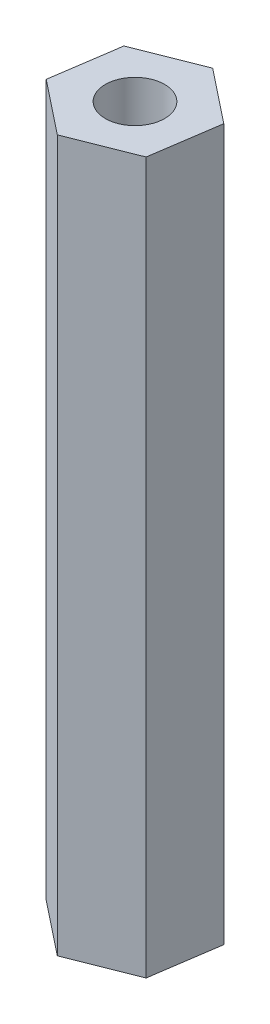
ISO-10303-21;
HEADER;
FILE_DESCRIPTION(('STEP AP214'),'2;1');
FILE_NAME('part.step','',(''),(''),'','','');
FILE_SCHEMA(('AUTOMOTIVE_DESIGN { 1 0 10303 214 1 1 1 1 }'));
ENDSEC;
DATA;
#1=APPLICATION_CONTEXT('core data for automotive mechanical design processes');
#2=APPLICATION_PROTOCOL_DEFINITION('international standard','automotive_design',2000,#1);
#3=PRODUCT_CONTEXT('',#1,'mechanical');
#4=PRODUCT('Part','Part','',(#3));
#5=PRODUCT_RELATED_PRODUCT_CATEGORY('part','',(#4));
#6=PRODUCT_DEFINITION_FORMATION('','',#4);
#7=PRODUCT_DEFINITION_CONTEXT('part definition',#1,'design');
#8=PRODUCT_DEFINITION('design','',#6,#7);
#9=PRODUCT_DEFINITION_SHAPE('','',#8);
#10=(LENGTH_UNIT() NAMED_UNIT(*) SI_UNIT(.MILLI.,.METRE.));
#11=(NAMED_UNIT(*) PLANE_ANGLE_UNIT() SI_UNIT($,.RADIAN.));
#12=(NAMED_UNIT(*) SI_UNIT($,.STERADIAN.) SOLID_ANGLE_UNIT());
#13=UNCERTAINTY_MEASURE_WITH_UNIT(LENGTH_MEASURE(1.E-05),#10,'distance_accuracy_value','');
#14=(GEOMETRIC_REPRESENTATION_CONTEXT(3) GLOBAL_UNCERTAINTY_ASSIGNED_CONTEXT((#13)) GLOBAL_UNIT_ASSIGNED_CONTEXT((#10,
#11,#12)) REPRESENTATION_CONTEXT('',''));
#15=CARTESIAN_POINT('',(0.,0.,0.));
#16=DIRECTION('',(0.,0.,1.));
#17=DIRECTION('',(1.,0.,0.));
#18=AXIS2_PLACEMENT_3D('',#15,#16,#17);
#19=CARTESIAN_POINT('',(0.,36.,0.));
#20=DIRECTION('',(0.,1.,0.));
#21=DIRECTION('',(0.,0.,1.));
#22=AXIS2_PLACEMENT_3D('',#19,#20,#21);
#23=PLANE('',#22);
#24=DIRECTION('',(0.929567430255253,0.,-0.368652129532227));
#25=VECTOR('',#24,1.);
#26=CARTESIAN_POINT('',(-0.504101629666654,36.,3.42722650943404));
#27=LINE('',#26,#25);
#28=CARTESIAN_POINT('',(-0.504101629666654,36.,3.42722650943404));
#29=VERTEX_POINT('',#28);
#30=CARTESIAN_POINT('',(2.71601440686002,36.,2.15017807209748));
#31=VERTEX_POINT('',#30);
#32=EDGE_CURVE('E128',#29,#31,#27,.T.);
#33=ORIENTED_EDGE('',*,*,#32,.T.);
#34=DIRECTION('',(0.145521605793486,0.,-0.989355073897782));
#35=VECTOR('',#34,1.);
#36=CARTESIAN_POINT('',(2.71601440686002,36.,2.15017807209748));
#37=LINE('',#36,#35);
#38=CARTESIAN_POINT('',(3.22011603652667,36.,-1.27704843733656));
#39=VERTEX_POINT('',#38);
#40=EDGE_CURVE('E86',#31,#39,#37,.T.);
#41=ORIENTED_EDGE('',*,*,#40,.T.);
#42=DIRECTION('',(-0.784045824461767,0.,-0.620702944365555));
#43=VECTOR('',#42,1.);
#44=CARTESIAN_POINT('',(3.22011603652667,36.,-1.27704843733656));
#45=LINE('',#44,#43);
#46=CARTESIAN_POINT('',(0.504101629666656,36.,-3.42722650943404));
#47=VERTEX_POINT('',#46);
#48=EDGE_CURVE('E99',#39,#47,#45,.T.);
#49=ORIENTED_EDGE('',*,*,#48,.T.);
#50=DIRECTION('',(-0.929567430255253,0.,0.368652129532227));
#51=VECTOR('',#50,1.);
#52=CARTESIAN_POINT('',(0.504101629666656,36.,-3.42722650943404));
#53=LINE('',#52,#51);
#54=CARTESIAN_POINT('',(-2.71601440686002,36.,-2.15017807209748));
#55=VERTEX_POINT('',#54);
#56=EDGE_CURVE('E93',#47,#55,#53,.T.);
#57=ORIENTED_EDGE('',*,*,#56,.T.);
#58=DIRECTION('',(-0.145521605793486,0.,0.989355073897782));
#59=VECTOR('',#58,1.);
#60=CARTESIAN_POINT('',(-2.71601440686002,36.,-2.15017807209748));
#61=LINE('',#60,#59);
#62=CARTESIAN_POINT('',(-3.22011603652667,36.,1.27704843733656));
#63=VERTEX_POINT('',#62);
#64=EDGE_CURVE('E97',#55,#63,#61,.T.);
#65=ORIENTED_EDGE('',*,*,#64,.T.);
#66=DIRECTION('',(0.784045824461767,0.,0.620702944365555));
#67=VECTOR('',#66,1.);
#68=CARTESIAN_POINT('',(-3.22011603652667,36.,1.27704843733656));
#69=LINE('',#68,#67);
#70=EDGE_CURVE('E49',#63,#29,#69,.T.);
#71=ORIENTED_EDGE('',*,*,#70,.T.);
#72=EDGE_LOOP('',(#33,#41,#49,#57,#65,#71));
#73=FACE_BOUND('',#72,.T.);
#74=CARTESIAN_POINT('',(0.,36.,0.));
#75=DIRECTION('',(0.,1.,0.));
#76=DIRECTION('',(0.,0.,1.));
#77=AXIS2_PLACEMENT_3D('',#74,#75,#76);
#78=CIRCLE('',#77,1.5);
#79=CARTESIAN_POINT('',(0.,36.,1.5));
#80=VERTEX_POINT('',#79);
#81=EDGE_CURVE('E121',#80,#80,#78,.T.);
#82=ORIENTED_EDGE('',*,*,#81,.F.);
#83=EDGE_LOOP('',(#82));
#84=FACE_BOUND('',#83,.T.);
#85=ADVANCED_FACE('F32',(#73,#84),#23,.T.);
#86=CARTESIAN_POINT('',(0.,0.,0.));
#87=DIRECTION('',(0.,1.,0.));
#88=DIRECTION('',(0.,0.,1.));
#89=AXIS2_PLACEMENT_3D('',#86,#87,#88);
#90=PLANE('',#89);
#91=DIRECTION('',(0.929567430255253,0.,-0.368652129532227));
#92=VECTOR('',#91,1.);
#93=CARTESIAN_POINT('',(-0.504101629666654,0.,3.42722650943404));
#94=LINE('',#93,#92);
#95=CARTESIAN_POINT('',(-0.504101629666654,0.,3.42722650943404));
#96=VERTEX_POINT('',#95);
#97=CARTESIAN_POINT('',(2.71601440686002,0.,2.15017807209748));
#98=VERTEX_POINT('',#97);
#99=EDGE_CURVE('E117',#96,#98,#94,.T.);
#100=ORIENTED_EDGE('',*,*,#99,.F.);
#101=DIRECTION('',(0.784045824461767,0.,0.620702944365555));
#102=VECTOR('',#101,1.);
#103=CARTESIAN_POINT('',(-3.22011603652667,0.,1.27704843733656));
#104=LINE('',#103,#102);
#105=CARTESIAN_POINT('',(-3.22011603652667,0.,1.27704843733656));
#106=VERTEX_POINT('',#105);
#107=EDGE_CURVE('E78',#106,#96,#104,.T.);
#108=ORIENTED_EDGE('',*,*,#107,.F.);
#109=DIRECTION('',(-0.145521605793486,0.,0.989355073897782));
#110=VECTOR('',#109,1.);
#111=CARTESIAN_POINT('',(-2.71601440686002,0.,-2.15017807209748));
#112=LINE('',#111,#110);
#113=CARTESIAN_POINT('',(-2.71601440686002,0.,-2.15017807209748));
#114=VERTEX_POINT('',#113);
#115=EDGE_CURVE('E72',#114,#106,#112,.T.);
#116=ORIENTED_EDGE('',*,*,#115,.F.);
#117=DIRECTION('',(-0.929567430255253,0.,0.368652129532227));
#118=VECTOR('',#117,1.);
#119=CARTESIAN_POINT('',(0.504101629666656,0.,-3.42722650943404));
#120=LINE('',#119,#118);
#121=CARTESIAN_POINT('',(0.504101629666656,0.,-3.42722650943404));
#122=VERTEX_POINT('',#121);
#123=EDGE_CURVE('E107',#122,#114,#120,.T.);
#124=ORIENTED_EDGE('',*,*,#123,.F.);
#125=DIRECTION('',(-0.784045824461767,0.,-0.620702944365555));
#126=VECTOR('',#125,1.);
#127=CARTESIAN_POINT('',(3.22011603652667,0.,-1.27704843733656));
#128=LINE('',#127,#126);
#129=CARTESIAN_POINT('',(3.22011603652667,0.,-1.27704843733656));
#130=VERTEX_POINT('',#129);
#131=EDGE_CURVE('E123',#130,#122,#128,.T.);
#132=ORIENTED_EDGE('',*,*,#131,.F.);
#133=DIRECTION('',(0.145521605793486,0.,-0.989355073897782));
#134=VECTOR('',#133,1.);
#135=CARTESIAN_POINT('',(2.71601440686002,0.,2.15017807209748));
#136=LINE('',#135,#134);
#137=EDGE_CURVE('E120',#98,#130,#136,.T.);
#138=ORIENTED_EDGE('',*,*,#137,.F.);
#139=EDGE_LOOP('',(#100,#108,#116,#124,#132,#138));
#140=FACE_BOUND('',#139,.T.);
#141=CARTESIAN_POINT('',(0.,0.,0.));
#142=DIRECTION('',(0.,1.,0.));
#143=DIRECTION('',(0.,0.,1.));
#144=AXIS2_PLACEMENT_3D('',#141,#142,#143);
#145=CIRCLE('',#144,1.5);
#146=CARTESIAN_POINT('',(0.,0.,1.5));
#147=VERTEX_POINT('',#146);
#148=EDGE_CURVE('E221',#147,#147,#145,.T.);
#149=ORIENTED_EDGE('',*,*,#148,.T.);
#150=EDGE_LOOP('',(#149));
#151=FACE_BOUND('',#150,.T.);
#152=ADVANCED_FACE('F137',(#140,#151),#90,.F.);
#153=CARTESIAN_POINT('',(-0.504101629666654,36.,3.42722650943404));
#154=DIRECTION('',(-0.368652129532227,0.,-0.929567430255253));
#155=DIRECTION('',(-0.929567430255253,0.,0.368652129532227));
#156=AXIS2_PLACEMENT_3D('',#153,#154,#155);
#157=PLANE('',#156);
#158=ORIENTED_EDGE('',*,*,#99,.T.);
#159=DIRECTION('',(0.,-1.,0.));
#160=VECTOR('',#159,1.);
#161=CARTESIAN_POINT('',(2.71601440686002,36.,2.15017807209748));
#162=LINE('',#161,#160);
#163=EDGE_CURVE('E11',#31,#98,#162,.T.);
#164=ORIENTED_EDGE('',*,*,#163,.F.);
#165=ORIENTED_EDGE('',*,*,#32,.F.);
#166=DIRECTION('',(0.,-1.,0.));
#167=VECTOR('',#166,1.);
#168=CARTESIAN_POINT('',(-0.504101629666654,36.,3.42722650943404));
#169=LINE('',#168,#167);
#170=EDGE_CURVE('E113',#29,#96,#169,.T.);
#171=ORIENTED_EDGE('',*,*,#170,.T.);
#172=EDGE_LOOP('',(#158,#164,#165,#171));
#173=FACE_BOUND('',#172,.T.);
#174=ADVANCED_FACE('F34',(#173),#157,.F.);
#175=CARTESIAN_POINT('',(2.71601440686002,36.,2.15017807209748));
#176=DIRECTION('',(-0.989355073897782,0.,-0.145521605793486));
#177=DIRECTION('',(-0.145521605793486,0.,0.989355073897782));
#178=AXIS2_PLACEMENT_3D('',#175,#176,#177);
#179=PLANE('',#178);
#180=ORIENTED_EDGE('',*,*,#137,.T.);
#181=DIRECTION('',(0.,-1.,0.));
#182=VECTOR('',#181,1.);
#183=CARTESIAN_POINT('',(3.22011603652667,36.,-1.27704843733656));
#184=LINE('',#183,#182);
#185=EDGE_CURVE('E41',#39,#130,#184,.T.);
#186=ORIENTED_EDGE('',*,*,#185,.F.);
#187=ORIENTED_EDGE('',*,*,#40,.F.);
#188=ORIENTED_EDGE('',*,*,#163,.T.);
#189=EDGE_LOOP('',(#180,#186,#187,#188));
#190=FACE_BOUND('',#189,.T.);
#191=ADVANCED_FACE('F162',(#190),#179,.F.);
#192=CARTESIAN_POINT('',(3.22011603652667,36.,-1.27704843733656));
#193=DIRECTION('',(-0.620702944365555,0.,0.784045824461766));
#194=DIRECTION('',(0.784045824461767,0.,0.620702944365555));
#195=AXIS2_PLACEMENT_3D('',#192,#193,#194);
#196=PLANE('',#195);
#197=ORIENTED_EDGE('',*,*,#131,.T.);
#198=DIRECTION('',(0.,-1.,0.));
#199=VECTOR('',#198,1.);
#200=CARTESIAN_POINT('',(0.504101629666656,36.,-3.42722650943404));
#201=LINE('',#200,#199);
#202=EDGE_CURVE('E108',#47,#122,#201,.T.);
#203=ORIENTED_EDGE('',*,*,#202,.F.);
#204=ORIENTED_EDGE('',*,*,#48,.F.);
#205=ORIENTED_EDGE('',*,*,#185,.T.);
#206=EDGE_LOOP('',(#197,#203,#204,#205));
#207=FACE_BOUND('',#206,.T.);
#208=ADVANCED_FACE('F134',(#207),#196,.F.);
#209=CARTESIAN_POINT('',(0.504101629666656,36.,-3.42722650943404));
#210=DIRECTION('',(0.368652129532227,0.,0.929567430255253));
#211=DIRECTION('',(0.929567430255253,0.,-0.368652129532227));
#212=AXIS2_PLACEMENT_3D('',#209,#210,#211);
#213=PLANE('',#212);
#214=ORIENTED_EDGE('',*,*,#123,.T.);
#215=DIRECTION('',(0.,-1.,0.));
#216=VECTOR('',#215,1.);
#217=CARTESIAN_POINT('',(-2.71601440686002,36.,-2.15017807209748));
#218=LINE('',#217,#216);
#219=EDGE_CURVE('E104',#55,#114,#218,.T.);
#220=ORIENTED_EDGE('',*,*,#219,.F.);
#221=ORIENTED_EDGE('',*,*,#56,.F.);
#222=ORIENTED_EDGE('',*,*,#202,.T.);
#223=EDGE_LOOP('',(#214,#220,#221,#222));
#224=FACE_BOUND('',#223,.T.);
#225=ADVANCED_FACE('F105',(#224),#213,.F.);
#226=CARTESIAN_POINT('',(-2.71601440686002,36.,-2.15017807209748));
#227=DIRECTION('',(0.989355073897782,0.,0.145521605793486));
#228=DIRECTION('',(0.145521605793486,0.,-0.989355073897782));
#229=AXIS2_PLACEMENT_3D('',#226,#227,#228);
#230=PLANE('',#229);
#231=ORIENTED_EDGE('',*,*,#115,.T.);
#232=DIRECTION('',(0.,-1.,0.));
#233=VECTOR('',#232,1.);
#234=CARTESIAN_POINT('',(-3.22011603652667,36.,1.27704843733656));
#235=LINE('',#234,#233);
#236=EDGE_CURVE('E109',#63,#106,#235,.T.);
#237=ORIENTED_EDGE('',*,*,#236,.F.);
#238=ORIENTED_EDGE('',*,*,#64,.F.);
#239=ORIENTED_EDGE('',*,*,#219,.T.);
#240=EDGE_LOOP('',(#231,#237,#238,#239));
#241=FACE_BOUND('',#240,.T.);
#242=ADVANCED_FACE('F111',(#241),#230,.F.);
#243=CARTESIAN_POINT('',(-3.22011603652667,36.,1.27704843733656));
#244=DIRECTION('',(0.620702944365555,0.,-0.784045824461766));
#245=DIRECTION('',(-0.784045824461767,0.,-0.620702944365555));
#246=AXIS2_PLACEMENT_3D('',#243,#244,#245);
#247=PLANE('',#246);
#248=ORIENTED_EDGE('',*,*,#107,.T.);
#249=ORIENTED_EDGE('',*,*,#170,.F.);
#250=ORIENTED_EDGE('',*,*,#70,.F.);
#251=ORIENTED_EDGE('',*,*,#236,.T.);
#252=EDGE_LOOP('',(#248,#249,#250,#251));
#253=FACE_BOUND('',#252,.T.);
#254=ADVANCED_FACE('F142',(#253),#247,.F.);
#255=CARTESIAN_POINT('',(0.,36.,0.));
#256=DIRECTION('',(0.,-1.,0.));
#257=DIRECTION('',(0.,0.,-1.));
#258=AXIS2_PLACEMENT_3D('',#255,#256,#257);
#259=CYLINDRICAL_SURFACE('',#258,1.5);
#260=ORIENTED_EDGE('',*,*,#81,.T.);
#261=EDGE_LOOP('',(#260));
#262=FACE_BOUND('',#261,.T.);
#263=ORIENTED_EDGE('',*,*,#148,.F.);
#264=EDGE_LOOP('',(#263));
#265=FACE_BOUND('',#264,.T.);
#266=ADVANCED_FACE('F144',(#262,#265),#259,.F.);
#267=CLOSED_SHELL('',(#85,#152,#174,#191,#208,#225,#242,#254,#266));
#268=MANIFOLD_SOLID_BREP('B2',#267);
#269=ADVANCED_BREP_SHAPE_REPRESENTATION('',(#18,#268),#14);
#270=SHAPE_DEFINITION_REPRESENTATION(#9,#269);
ENDSEC;
END-ISO-10303-21;
